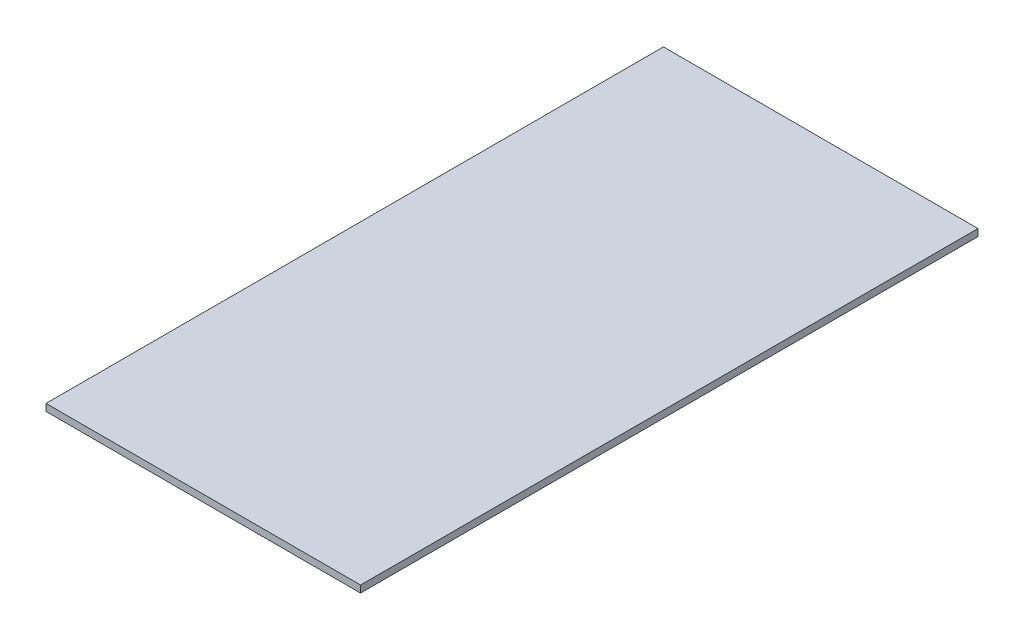
ISO-10303-21;
HEADER;
FILE_DESCRIPTION(('STEP AP214'),'2;1');
FILE_NAME('part.step','',(''),(''),'','','');
FILE_SCHEMA(('AUTOMOTIVE_DESIGN { 1 0 10303 214 1 1 1 1 }'));
ENDSEC;
DATA;
#1=APPLICATION_CONTEXT('core data for automotive mechanical design processes');
#2=APPLICATION_PROTOCOL_DEFINITION('international standard','automotive_design',2000,#1);
#3=PRODUCT_CONTEXT('',#1,'mechanical');
#4=PRODUCT('Part','Part','',(#3));
#5=PRODUCT_RELATED_PRODUCT_CATEGORY('part','',(#4));
#6=PRODUCT_DEFINITION_FORMATION('','',#4);
#7=PRODUCT_DEFINITION_CONTEXT('part definition',#1,'design');
#8=PRODUCT_DEFINITION('design','',#6,#7);
#9=PRODUCT_DEFINITION_SHAPE('','',#8);
#10=(LENGTH_UNIT() NAMED_UNIT(*) SI_UNIT(.MILLI.,.METRE.));
#11=(NAMED_UNIT(*) PLANE_ANGLE_UNIT() SI_UNIT($,.RADIAN.));
#12=(NAMED_UNIT(*) SI_UNIT($,.STERADIAN.) SOLID_ANGLE_UNIT());
#13=UNCERTAINTY_MEASURE_WITH_UNIT(LENGTH_MEASURE(1.E-05),#10,'distance_accuracy_value','');
#14=(GEOMETRIC_REPRESENTATION_CONTEXT(3) GLOBAL_UNCERTAINTY_ASSIGNED_CONTEXT((#13)) GLOBAL_UNIT_ASSIGNED_CONTEXT((#10,
#11,#12)) REPRESENTATION_CONTEXT('',''));
#15=CARTESIAN_POINT('',(0.,0.,0.));
#16=DIRECTION('',(0.,0.,1.));
#17=DIRECTION('',(1.,0.,0.));
#18=AXIS2_PLACEMENT_3D('',#15,#16,#17);
#19=CARTESIAN_POINT('',(135.,6.,265.));
#20=DIRECTION('',(-1.,0.,0.));
#21=DIRECTION('',(0.,0.,1.));
#22=AXIS2_PLACEMENT_3D('',#19,#20,#21);
#23=PLANE('',#22);
#24=DIRECTION('',(0.,0.,-1.));
#25=VECTOR('',#24,1.);
#26=CARTESIAN_POINT('',(135.,0.,265.));
#27=LINE('',#26,#25);
#28=CARTESIAN_POINT('',(135.,0.,265.));
#29=VERTEX_POINT('',#28);
#30=CARTESIAN_POINT('',(135.,0.,-265.));
#31=VERTEX_POINT('',#30);
#32=EDGE_CURVE('E80',#29,#31,#27,.T.);
#33=ORIENTED_EDGE('',*,*,#32,.T.);
#34=DIRECTION('',(0.,-1.,0.));
#35=VECTOR('',#34,1.);
#36=CARTESIAN_POINT('',(135.,6.,-265.));
#37=LINE('',#36,#35);
#38=CARTESIAN_POINT('',(135.,6.,-265.));
#39=VERTEX_POINT('',#38);
#40=EDGE_CURVE('E11',#39,#31,#37,.T.);
#41=ORIENTED_EDGE('',*,*,#40,.F.);
#42=DIRECTION('',(0.,0.,-1.));
#43=VECTOR('',#42,1.);
#44=CARTESIAN_POINT('',(135.,6.,265.));
#45=LINE('',#44,#43);
#46=CARTESIAN_POINT('',(135.,6.,265.));
#47=VERTEX_POINT('',#46);
#48=EDGE_CURVE('E68',#47,#39,#45,.T.);
#49=ORIENTED_EDGE('',*,*,#48,.F.);
#50=DIRECTION('',(0.,-1.,0.));
#51=VECTOR('',#50,1.);
#52=CARTESIAN_POINT('',(135.,6.,265.));
#53=LINE('',#52,#51);
#54=EDGE_CURVE('E76',#47,#29,#53,.T.);
#55=ORIENTED_EDGE('',*,*,#54,.T.);
#56=EDGE_LOOP('',(#33,#41,#49,#55));
#57=FACE_BOUND('',#56,.T.);
#58=ADVANCED_FACE('F17',(#57),#23,.F.);
#59=CARTESIAN_POINT('',(-135.,6.,-265.));
#60=DIRECTION('',(0.,0.,1.));
#61=DIRECTION('',(1.,0.,0.));
#62=AXIS2_PLACEMENT_3D('',#59,#60,#61);
#63=PLANE('',#62);
#64=DIRECTION('',(-1.,0.,0.));
#65=VECTOR('',#64,1.);
#66=CARTESIAN_POINT('',(-135.,0.,-265.));
#67=LINE('',#66,#65);
#68=CARTESIAN_POINT('',(-135.,0.,-265.));
#69=VERTEX_POINT('',#68);
#70=EDGE_CURVE('E72',#31,#69,#67,.T.);
#71=ORIENTED_EDGE('',*,*,#70,.T.);
#72=DIRECTION('',(0.,-1.,0.));
#73=VECTOR('',#72,1.);
#74=CARTESIAN_POINT('',(-135.,6.,-265.));
#75=LINE('',#74,#73);
#76=CARTESIAN_POINT('',(-135.,6.,-265.));
#77=VERTEX_POINT('',#76);
#78=EDGE_CURVE('E25',#77,#69,#75,.T.);
#79=ORIENTED_EDGE('',*,*,#78,.F.);
#80=DIRECTION('',(-1.,0.,0.));
#81=VECTOR('',#80,1.);
#82=CARTESIAN_POINT('',(-135.,6.,-265.));
#83=LINE('',#82,#81);
#84=EDGE_CURVE('E63',#39,#77,#83,.T.);
#85=ORIENTED_EDGE('',*,*,#84,.F.);
#86=ORIENTED_EDGE('',*,*,#40,.T.);
#87=EDGE_LOOP('',(#71,#79,#85,#86));
#88=FACE_BOUND('',#87,.T.);
#89=ADVANCED_FACE('F71',(#88),#63,.F.);
#90=CARTESIAN_POINT('',(-135.,6.,265.));
#91=DIRECTION('',(1.,0.,0.));
#92=DIRECTION('',(0.,0.,-1.));
#93=AXIS2_PLACEMENT_3D('',#90,#91,#92);
#94=PLANE('',#93);
#95=DIRECTION('',(0.,0.,1.));
#96=VECTOR('',#95,1.);
#97=CARTESIAN_POINT('',(-135.,0.,265.));
#98=LINE('',#97,#96);
#99=CARTESIAN_POINT('',(-135.,0.,265.));
#100=VERTEX_POINT('',#99);
#101=EDGE_CURVE('E50',#69,#100,#98,.T.);
#102=ORIENTED_EDGE('',*,*,#101,.T.);
#103=DIRECTION('',(0.,-1.,0.));
#104=VECTOR('',#103,1.);
#105=CARTESIAN_POINT('',(-135.,6.,265.));
#106=LINE('',#105,#104);
#107=CARTESIAN_POINT('',(-135.,6.,265.));
#108=VERTEX_POINT('',#107);
#109=EDGE_CURVE('E73',#108,#100,#106,.T.);
#110=ORIENTED_EDGE('',*,*,#109,.F.);
#111=DIRECTION('',(0.,0.,1.));
#112=VECTOR('',#111,1.);
#113=CARTESIAN_POINT('',(-135.,6.,265.));
#114=LINE('',#113,#112);
#115=EDGE_CURVE('E66',#77,#108,#114,.T.);
#116=ORIENTED_EDGE('',*,*,#115,.F.);
#117=ORIENTED_EDGE('',*,*,#78,.T.);
#118=EDGE_LOOP('',(#102,#110,#116,#117));
#119=FACE_BOUND('',#118,.T.);
#120=ADVANCED_FACE('F74',(#119),#94,.F.);
#121=CARTESIAN_POINT('',(-135.,6.,265.));
#122=DIRECTION('',(0.,0.,-1.));
#123=DIRECTION('',(-1.,0.,0.));
#124=AXIS2_PLACEMENT_3D('',#121,#122,#123);
#125=PLANE('',#124);
#126=DIRECTION('',(1.,0.,0.));
#127=VECTOR('',#126,1.);
#128=CARTESIAN_POINT('',(-135.,0.,265.));
#129=LINE('',#128,#127);
#130=EDGE_CURVE('E56',#100,#29,#129,.T.);
#131=ORIENTED_EDGE('',*,*,#130,.T.);
#132=ORIENTED_EDGE('',*,*,#54,.F.);
#133=DIRECTION('',(1.,0.,0.));
#134=VECTOR('',#133,1.);
#135=CARTESIAN_POINT('',(-135.,6.,265.));
#136=LINE('',#135,#134);
#137=EDGE_CURVE('E33',#108,#47,#136,.T.);
#138=ORIENTED_EDGE('',*,*,#137,.F.);
#139=ORIENTED_EDGE('',*,*,#109,.T.);
#140=EDGE_LOOP('',(#131,#132,#138,#139));
#141=FACE_BOUND('',#140,.T.);
#142=ADVANCED_FACE('F87',(#141),#125,.F.);
#143=CARTESIAN_POINT('',(0.,6.,0.));
#144=DIRECTION('',(0.,-1.,0.));
#145=DIRECTION('',(0.,0.,-1.));
#146=AXIS2_PLACEMENT_3D('',#143,#144,#145);
#147=PLANE('',#146);
#148=ORIENTED_EDGE('',*,*,#48,.T.);
#149=ORIENTED_EDGE('',*,*,#84,.T.);
#150=ORIENTED_EDGE('',*,*,#115,.T.);
#151=ORIENTED_EDGE('',*,*,#137,.T.);
#152=EDGE_LOOP('',(#148,#149,#150,#151));
#153=FACE_BOUND('',#152,.T.);
#154=ADVANCED_FACE('F64',(#153),#147,.F.);
#155=CARTESIAN_POINT('',(0.,0.,0.));
#156=DIRECTION('',(0.,-1.,0.));
#157=DIRECTION('',(0.,0.,-1.));
#158=AXIS2_PLACEMENT_3D('',#155,#156,#157);
#159=PLANE('',#158);
#160=ORIENTED_EDGE('',*,*,#32,.F.);
#161=ORIENTED_EDGE('',*,*,#130,.F.);
#162=ORIENTED_EDGE('',*,*,#101,.F.);
#163=ORIENTED_EDGE('',*,*,#70,.F.);
#164=EDGE_LOOP('',(#160,#161,#162,#163));
#165=FACE_BOUND('',#164,.T.);
#166=ADVANCED_FACE('F90',(#165),#159,.T.);
#167=CLOSED_SHELL('',(#58,#89,#120,#142,#154,#166));
#168=MANIFOLD_SOLID_BREP('B1',#167);
#169=ADVANCED_BREP_SHAPE_REPRESENTATION('',(#18,#168),#14);
#170=SHAPE_DEFINITION_REPRESENTATION(#9,#169);
ENDSEC;
END-ISO-10303-21;
